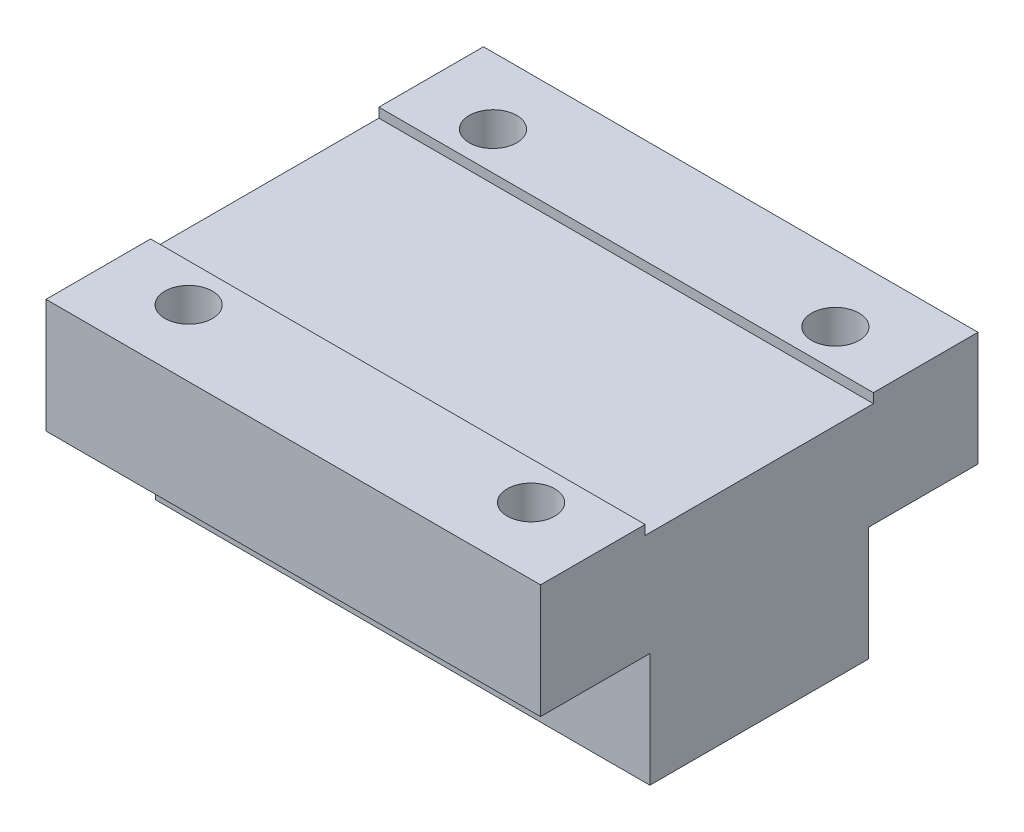
ISO-10303-21;
HEADER;
FILE_DESCRIPTION(('STEP AP214'),'2;1');
FILE_NAME('part.step','',(''),(''),'','','');
FILE_SCHEMA(('AUTOMOTIVE_DESIGN { 1 0 10303 214 1 1 1 1 }'));
ENDSEC;
DATA;
#1=APPLICATION_CONTEXT('core data for automotive mechanical design processes');
#2=APPLICATION_PROTOCOL_DEFINITION('international standard','automotive_design',2000,#1);
#3=PRODUCT_CONTEXT('',#1,'mechanical');
#4=PRODUCT('Part','Part','',(#3));
#5=PRODUCT_RELATED_PRODUCT_CATEGORY('part','',(#4));
#6=PRODUCT_DEFINITION_FORMATION('','',#4);
#7=PRODUCT_DEFINITION_CONTEXT('part definition',#1,'design');
#8=PRODUCT_DEFINITION('design','',#6,#7);
#9=PRODUCT_DEFINITION_SHAPE('','',#8);
#10=(LENGTH_UNIT() NAMED_UNIT(*) SI_UNIT(.MILLI.,.METRE.));
#11=(NAMED_UNIT(*) PLANE_ANGLE_UNIT() SI_UNIT($,.RADIAN.));
#12=(NAMED_UNIT(*) SI_UNIT($,.STERADIAN.) SOLID_ANGLE_UNIT());
#13=UNCERTAINTY_MEASURE_WITH_UNIT(LENGTH_MEASURE(1.E-05),#10,'distance_accuracy_value','');
#14=(GEOMETRIC_REPRESENTATION_CONTEXT(3) GLOBAL_UNCERTAINTY_ASSIGNED_CONTEXT((#13)) GLOBAL_UNIT_ASSIGNED_CONTEXT((#10,
#11,#12)) REPRESENTATION_CONTEXT('',''));
#15=CARTESIAN_POINT('',(0.,0.,0.));
#16=DIRECTION('',(0.,0.,1.));
#17=DIRECTION('',(1.,0.,0.));
#18=AXIS2_PLACEMENT_3D('',#15,#16,#17);
#19=CARTESIAN_POINT('',(0.,12.,0.));
#20=DIRECTION('',(0.,-1.,0.));
#21=DIRECTION('',(0.,0.,-1.));
#22=AXIS2_PLACEMENT_3D('',#19,#20,#21);
#23=PLANE('',#22);
#24=CARTESIAN_POINT('',(8.,12.,-39.));
#25=DIRECTION('',(0.,1.,0.));
#26=DIRECTION('',(0.,0.,1.));
#27=AXIS2_PLACEMENT_3D('',#24,#25,#26);
#28=CIRCLE('',#27,2.5);
#29=CARTESIAN_POINT('',(8.,12.,-36.5));
#30=VERTEX_POINT('',#29);
#31=EDGE_CURVE('E169',#30,#30,#28,.T.);
#32=ORIENTED_EDGE('',*,*,#31,.F.);
#33=EDGE_LOOP('',(#32));
#34=FACE_BOUND('',#33,.T.);
#35=CARTESIAN_POINT('',(44.,12.,-39.));
#36=DIRECTION('',(0.,1.,0.));
#37=DIRECTION('',(0.,0.,-1.));
#38=AXIS2_PLACEMENT_3D('',#35,#36,#37);
#39=CIRCLE('',#38,2.5);
#40=CARTESIAN_POINT('',(44.,12.,-41.5));
#41=VERTEX_POINT('',#40);
#42=EDGE_CURVE('E153',#41,#41,#39,.T.);
#43=ORIENTED_EDGE('',*,*,#42,.F.);
#44=EDGE_LOOP('',(#43));
#45=FACE_BOUND('',#44,.T.);
#46=DIRECTION('',(0.,0.,1.));
#47=VECTOR('',#46,1.);
#48=CARTESIAN_POINT('',(0.,12.,0.));
#49=LINE('',#48,#47);
#50=CARTESIAN_POINT('',(0.,12.,-46.));
#51=VERTEX_POINT('',#50);
#52=CARTESIAN_POINT('',(0.,12.,-35.));
#53=VERTEX_POINT('',#52);
#54=EDGE_CURVE('E229',#51,#53,#49,.T.);
#55=ORIENTED_EDGE('',*,*,#54,.T.);
#56=DIRECTION('',(1.,0.,0.));
#57=VECTOR('',#56,1.);
#58=CARTESIAN_POINT('',(0.,12.,-35.));
#59=LINE('',#58,#57);
#60=CARTESIAN_POINT('',(52.,12.,-35.));
#61=VERTEX_POINT('',#60);
#62=EDGE_CURVE('E45',#53,#61,#59,.T.);
#63=ORIENTED_EDGE('',*,*,#62,.T.);
#64=DIRECTION('',(0.,0.,-1.));
#65=VECTOR('',#64,1.);
#66=CARTESIAN_POINT('',(52.,12.,0.));
#67=LINE('',#66,#65);
#68=CARTESIAN_POINT('',(52.,12.,-46.));
#69=VERTEX_POINT('',#68);
#70=EDGE_CURVE('E226',#61,#69,#67,.T.);
#71=ORIENTED_EDGE('',*,*,#70,.T.);
#72=DIRECTION('',(-1.,0.,0.));
#73=VECTOR('',#72,1.);
#74=CARTESIAN_POINT('',(0.,12.,-46.));
#75=LINE('',#74,#73);
#76=EDGE_CURVE('E240',#69,#51,#75,.T.);
#77=ORIENTED_EDGE('',*,*,#76,.T.);
#78=EDGE_LOOP('',(#55,#63,#71,#77));
#79=FACE_BOUND('',#78,.T.);
#80=ADVANCED_FACE('F37',(#34,#45,#79),#23,.F.);
#81=CARTESIAN_POINT('',(0.,0.,0.));
#82=DIRECTION('',(0.,-1.,0.));
#83=DIRECTION('',(0.,0.,-1.));
#84=AXIS2_PLACEMENT_3D('',#81,#82,#83);
#85=PLANE('',#84);
#86=CARTESIAN_POINT('',(44.,0.,-7.));
#87=DIRECTION('',(0.,-1.,0.));
#88=DIRECTION('',(0.,0.,-1.));
#89=AXIS2_PLACEMENT_3D('',#86,#87,#88);
#90=CIRCLE('',#89,2.5);
#91=CARTESIAN_POINT('',(44.,0.,-9.50000000000001));
#92=VERTEX_POINT('',#91);
#93=EDGE_CURVE('E160',#92,#92,#90,.T.);
#94=ORIENTED_EDGE('',*,*,#93,.F.);
#95=EDGE_LOOP('',(#94));
#96=FACE_BOUND('',#95,.T.);
#97=CARTESIAN_POINT('',(8.00000000000001,0.,-7.));
#98=DIRECTION('',(0.,-1.,0.));
#99=DIRECTION('',(0.,0.,-1.));
#100=AXIS2_PLACEMENT_3D('',#97,#98,#99);
#101=CIRCLE('',#100,2.5);
#102=CARTESIAN_POINT('',(8.00000000000001,0.,-9.5));
#103=VERTEX_POINT('',#102);
#104=EDGE_CURVE('E166',#103,#103,#101,.T.);
#105=ORIENTED_EDGE('',*,*,#104,.F.);
#106=EDGE_LOOP('',(#105));
#107=FACE_BOUND('',#106,.T.);
#108=DIRECTION('',(-1.,0.,0.));
#109=VECTOR('',#108,1.);
#110=CARTESIAN_POINT('',(0.,0.,-11.5));
#111=LINE('',#110,#109);
#112=CARTESIAN_POINT('',(52.,0.,-11.5));
#113=VERTEX_POINT('',#112);
#114=CARTESIAN_POINT('',(0.,0.,-11.5));
#115=VERTEX_POINT('',#114);
#116=EDGE_CURVE('E60',#113,#115,#111,.T.);
#117=ORIENTED_EDGE('',*,*,#116,.F.);
#118=DIRECTION('',(0.,0.,-1.));
#119=VECTOR('',#118,1.);
#120=CARTESIAN_POINT('',(52.,0.,0.));
#121=LINE('',#120,#119);
#122=CARTESIAN_POINT('',(52.,0.,0.));
#123=VERTEX_POINT('',#122);
#124=EDGE_CURVE('E263',#123,#113,#121,.T.);
#125=ORIENTED_EDGE('',*,*,#124,.F.);
#126=DIRECTION('',(1.,0.,0.));
#127=VECTOR('',#126,1.);
#128=CARTESIAN_POINT('',(0.,0.,0.));
#129=LINE('',#128,#127);
#130=CARTESIAN_POINT('',(0.,0.,0.));
#131=VERTEX_POINT('',#130);
#132=EDGE_CURVE('E247',#131,#123,#129,.T.);
#133=ORIENTED_EDGE('',*,*,#132,.F.);
#134=DIRECTION('',(0.,0.,1.));
#135=VECTOR('',#134,1.);
#136=CARTESIAN_POINT('',(0.,0.,0.));
#137=LINE('',#136,#135);
#138=EDGE_CURVE('E204',#115,#131,#137,.T.);
#139=ORIENTED_EDGE('',*,*,#138,.F.);
#140=EDGE_LOOP('',(#117,#125,#133,#139));
#141=FACE_BOUND('',#140,.T.);
#142=ADVANCED_FACE('F273',(#96,#107,#141),#85,.T.);
#143=CARTESIAN_POINT('',(0.,12.,0.));
#144=DIRECTION('',(1.,0.,0.));
#145=DIRECTION('',(0.,0.,-1.));
#146=AXIS2_PLACEMENT_3D('',#143,#144,#145);
#147=PLANE('',#146);
#148=DIRECTION('',(0.,0.,1.));
#149=VECTOR('',#148,1.);
#150=CARTESIAN_POINT('',(0.,11.,-35.));
#151=LINE('',#150,#149);
#152=CARTESIAN_POINT('',(0.,11.,-35.));
#153=VERTEX_POINT('',#152);
#154=CARTESIAN_POINT('',(0.,11.,-11.));
#155=VERTEX_POINT('',#154);
#156=EDGE_CURVE('E135',#153,#155,#151,.T.);
#157=ORIENTED_EDGE('',*,*,#156,.F.);
#158=DIRECTION('',(0.,-1.,0.));
#159=VECTOR('',#158,1.);
#160=CARTESIAN_POINT('',(0.,11.,-35.));
#161=LINE('',#160,#159);
#162=EDGE_CURVE('E132',#53,#153,#161,.T.);
#163=ORIENTED_EDGE('',*,*,#162,.F.);
#164=ORIENTED_EDGE('',*,*,#54,.F.);
#165=DIRECTION('',(0.,-1.,0.));
#166=VECTOR('',#165,1.);
#167=CARTESIAN_POINT('',(0.,12.,-46.));
#168=LINE('',#167,#166);
#169=CARTESIAN_POINT('',(0.,0.,-46.));
#170=VERTEX_POINT('',#169);
#171=EDGE_CURVE('E244',#51,#170,#168,.T.);
#172=ORIENTED_EDGE('',*,*,#171,.T.);
#173=CARTESIAN_POINT('',(0.,0.,-34.5));
#174=VERTEX_POINT('',#173);
#175=EDGE_CURVE('E251',#170,#174,#137,.T.);
#176=ORIENTED_EDGE('',*,*,#175,.T.);
#177=DIRECTION('',(0.,1.,0.));
#178=VECTOR('',#177,1.);
#179=CARTESIAN_POINT('',(0.,-12.,-34.5));
#180=LINE('',#179,#178);
#181=CARTESIAN_POINT('',(0.,-12.,-34.5));
#182=VERTEX_POINT('',#181);
#183=EDGE_CURVE('E198',#182,#174,#180,.T.);
#184=ORIENTED_EDGE('',*,*,#183,.F.);
#185=DIRECTION('',(0.,0.,-1.));
#186=VECTOR('',#185,1.);
#187=CARTESIAN_POINT('',(0.,-12.,-34.5));
#188=LINE('',#187,#186);
#189=CARTESIAN_POINT('',(0.,-12.,-11.5));
#190=VERTEX_POINT('',#189);
#191=EDGE_CURVE('E173',#190,#182,#188,.T.);
#192=ORIENTED_EDGE('',*,*,#191,.F.);
#193=DIRECTION('',(0.,1.,0.));
#194=VECTOR('',#193,1.);
#195=CARTESIAN_POINT('',(0.,-12.,-11.5));
#196=LINE('',#195,#194);
#197=EDGE_CURVE('E182',#190,#115,#196,.T.);
#198=ORIENTED_EDGE('',*,*,#197,.T.);
#199=ORIENTED_EDGE('',*,*,#138,.T.);
#200=DIRECTION('',(0.,-1.,0.));
#201=VECTOR('',#200,1.);
#202=CARTESIAN_POINT('',(0.,12.,0.));
#203=LINE('',#202,#201);
#204=CARTESIAN_POINT('',(0.,12.,0.));
#205=VERTEX_POINT('',#204);
#206=EDGE_CURVE('E221',#205,#131,#203,.T.);
#207=ORIENTED_EDGE('',*,*,#206,.F.);
#208=CARTESIAN_POINT('',(0.,12.,-11.));
#209=VERTEX_POINT('',#208);
#210=EDGE_CURVE('E144',#209,#205,#49,.T.);
#211=ORIENTED_EDGE('',*,*,#210,.F.);
#212=DIRECTION('',(0.,1.,0.));
#213=VECTOR('',#212,1.);
#214=CARTESIAN_POINT('',(0.,11.,-11.));
#215=LINE('',#214,#213);
#216=EDGE_CURVE('E52',#155,#209,#215,.T.);
#217=ORIENTED_EDGE('',*,*,#216,.F.);
#218=EDGE_LOOP('',(#157,#163,#164,#172,#176,#184,#192,#198,#199,#207,#211,#217));
#219=FACE_BOUND('',#218,.T.);
#220=ADVANCED_FACE('F39',(#219),#147,.F.);
#221=CARTESIAN_POINT('',(0.,12.,0.));
#222=DIRECTION('',(0.,0.,-1.));
#223=DIRECTION('',(-1.,0.,0.));
#224=AXIS2_PLACEMENT_3D('',#221,#222,#223);
#225=PLANE('',#224);
#226=ORIENTED_EDGE('',*,*,#132,.T.);
#227=DIRECTION('',(0.,-1.,0.));
#228=VECTOR('',#227,1.);
#229=CARTESIAN_POINT('',(52.,12.,0.));
#230=LINE('',#229,#228);
#231=CARTESIAN_POINT('',(52.,12.,0.));
#232=VERTEX_POINT('',#231);
#233=EDGE_CURVE('E256',#232,#123,#230,.T.);
#234=ORIENTED_EDGE('',*,*,#233,.F.);
#235=DIRECTION('',(1.,0.,0.));
#236=VECTOR('',#235,1.);
#237=CARTESIAN_POINT('',(0.,12.,0.));
#238=LINE('',#237,#236);
#239=EDGE_CURVE('E237',#205,#232,#238,.T.);
#240=ORIENTED_EDGE('',*,*,#239,.F.);
#241=ORIENTED_EDGE('',*,*,#206,.T.);
#242=EDGE_LOOP('',(#226,#234,#240,#241));
#243=FACE_BOUND('',#242,.T.);
#244=ADVANCED_FACE('F270',(#243),#225,.F.);
#245=CARTESIAN_POINT('',(52.,12.,0.));
#246=DIRECTION('',(-1.,0.,0.));
#247=DIRECTION('',(0.,0.,1.));
#248=AXIS2_PLACEMENT_3D('',#245,#246,#247);
#249=PLANE('',#248);
#250=ORIENTED_EDGE('',*,*,#70,.F.);
#251=DIRECTION('',(0.,-1.,0.));
#252=VECTOR('',#251,1.);
#253=CARTESIAN_POINT('',(52.,12.,-35.));
#254=LINE('',#253,#252);
#255=CARTESIAN_POINT('',(52.,11.,-35.));
#256=VERTEX_POINT('',#255);
#257=EDGE_CURVE('E150',#61,#256,#254,.T.);
#258=ORIENTED_EDGE('',*,*,#257,.T.);
#259=DIRECTION('',(0.,0.,1.));
#260=VECTOR('',#259,1.);
#261=CARTESIAN_POINT('',(52.,11.,0.));
#262=LINE('',#261,#260);
#263=CARTESIAN_POINT('',(52.,11.,-11.));
#264=VERTEX_POINT('',#263);
#265=EDGE_CURVE('E11',#256,#264,#262,.T.);
#266=ORIENTED_EDGE('',*,*,#265,.T.);
#267=DIRECTION('',(0.,1.,0.));
#268=VECTOR('',#267,1.);
#269=CARTESIAN_POINT('',(52.,12.,-11.));
#270=LINE('',#269,#268);
#271=CARTESIAN_POINT('',(52.,12.,-11.));
#272=VERTEX_POINT('',#271);
#273=EDGE_CURVE('E129',#264,#272,#270,.T.);
#274=ORIENTED_EDGE('',*,*,#273,.T.);
#275=EDGE_CURVE('E236',#232,#272,#67,.T.);
#276=ORIENTED_EDGE('',*,*,#275,.F.);
#277=ORIENTED_EDGE('',*,*,#233,.T.);
#278=ORIENTED_EDGE('',*,*,#124,.T.);
#279=DIRECTION('',(0.,1.,0.));
#280=VECTOR('',#279,1.);
#281=CARTESIAN_POINT('',(52.,-12.,-11.5));
#282=LINE('',#281,#280);
#283=CARTESIAN_POINT('',(52.,-12.,-11.5));
#284=VERTEX_POINT('',#283);
#285=EDGE_CURVE('E199',#284,#113,#282,.T.);
#286=ORIENTED_EDGE('',*,*,#285,.F.);
#287=DIRECTION('',(0.,0.,1.));
#288=VECTOR('',#287,1.);
#289=CARTESIAN_POINT('',(52.,-12.,-34.5));
#290=LINE('',#289,#288);
#291=CARTESIAN_POINT('',(52.,-12.,-34.5));
#292=VERTEX_POINT('',#291);
#293=EDGE_CURVE('E178',#292,#284,#290,.T.);
#294=ORIENTED_EDGE('',*,*,#293,.F.);
#295=DIRECTION('',(0.,1.,0.));
#296=VECTOR('',#295,1.);
#297=CARTESIAN_POINT('',(52.,-12.,-34.5));
#298=LINE('',#297,#296);
#299=CARTESIAN_POINT('',(52.,0.,-34.5));
#300=VERTEX_POINT('',#299);
#301=EDGE_CURVE('E195',#292,#300,#298,.T.);
#302=ORIENTED_EDGE('',*,*,#301,.T.);
#303=CARTESIAN_POINT('',(52.,0.,-46.));
#304=VERTEX_POINT('',#303);
#305=EDGE_CURVE('E192',#300,#304,#121,.T.);
#306=ORIENTED_EDGE('',*,*,#305,.T.);
#307=DIRECTION('',(0.,-1.,0.));
#308=VECTOR('',#307,1.);
#309=CARTESIAN_POINT('',(52.,12.,-46.));
#310=LINE('',#309,#308);
#311=EDGE_CURVE('E234',#69,#304,#310,.T.);
#312=ORIENTED_EDGE('',*,*,#311,.F.);
#313=EDGE_LOOP('',(#250,#258,#266,#274,#276,#277,#278,#286,#294,#302,#306,#312));
#314=FACE_BOUND('',#313,.T.);
#315=ADVANCED_FACE('F232',(#314),#249,.F.);
#316=CARTESIAN_POINT('',(0.,12.,-46.));
#317=DIRECTION('',(0.,0.,1.));
#318=DIRECTION('',(1.,0.,0.));
#319=AXIS2_PLACEMENT_3D('',#316,#317,#318);
#320=PLANE('',#319);
#321=DIRECTION('',(-1.,0.,0.));
#322=VECTOR('',#321,1.);
#323=CARTESIAN_POINT('',(0.,0.,-46.));
#324=LINE('',#323,#322);
#325=EDGE_CURVE('E262',#304,#170,#324,.T.);
#326=ORIENTED_EDGE('',*,*,#325,.T.);
#327=ORIENTED_EDGE('',*,*,#171,.F.);
#328=ORIENTED_EDGE('',*,*,#76,.F.);
#329=ORIENTED_EDGE('',*,*,#311,.T.);
#330=EDGE_LOOP('',(#326,#327,#328,#329));
#331=FACE_BOUND('',#330,.T.);
#332=ADVANCED_FACE('F298',(#331),#320,.F.);
#333=CARTESIAN_POINT('',(44.,12.,-7.));
#334=DIRECTION('',(0.,1.,0.));
#335=DIRECTION('',(0.,0.,1.));
#336=AXIS2_PLACEMENT_3D('',#333,#334,#335);
#337=CIRCLE('',#336,2.5);
#338=CARTESIAN_POINT('',(44.,12.,-4.5));
#339=VERTEX_POINT('',#338);
#340=EDGE_CURVE('E157',#339,#339,#337,.T.);
#341=ORIENTED_EDGE('',*,*,#340,.F.);
#342=EDGE_LOOP('',(#341));
#343=FACE_BOUND('',#342,.T.);
#344=CARTESIAN_POINT('',(8.00000000000001,12.,-7.));
#345=DIRECTION('',(0.,1.,0.));
#346=DIRECTION('',(0.,0.,-1.));
#347=AXIS2_PLACEMENT_3D('',#344,#345,#346);
#348=CIRCLE('',#347,2.5);
#349=CARTESIAN_POINT('',(8.00000000000001,12.,-9.5));
#350=VERTEX_POINT('',#349);
#351=EDGE_CURVE('E163',#350,#350,#348,.T.);
#352=ORIENTED_EDGE('',*,*,#351,.F.);
#353=EDGE_LOOP('',(#352));
#354=FACE_BOUND('',#353,.T.);
#355=ORIENTED_EDGE('',*,*,#275,.T.);
#356=DIRECTION('',(-1.,0.,0.));
#357=VECTOR('',#356,1.);
#358=CARTESIAN_POINT('',(0.,12.,-11.));
#359=LINE('',#358,#357);
#360=EDGE_CURVE('E220',#272,#209,#359,.T.);
#361=ORIENTED_EDGE('',*,*,#360,.T.);
#362=ORIENTED_EDGE('',*,*,#210,.T.);
#363=ORIENTED_EDGE('',*,*,#239,.T.);
#364=EDGE_LOOP('',(#355,#361,#362,#363));
#365=FACE_BOUND('',#364,.T.);
#366=ADVANCED_FACE('F284',(#343,#354,#365),#23,.F.);
#367=CARTESIAN_POINT('',(44.,0.,-39.));
#368=DIRECTION('',(0.,-1.,0.));
#369=DIRECTION('',(0.,0.,-1.));
#370=AXIS2_PLACEMENT_3D('',#367,#368,#369);
#371=CIRCLE('',#370,2.5);
#372=CARTESIAN_POINT('',(44.,0.,-41.5));
#373=VERTEX_POINT('',#372);
#374=EDGE_CURVE('E156',#373,#373,#371,.T.);
#375=ORIENTED_EDGE('',*,*,#374,.F.);
#376=EDGE_LOOP('',(#375));
#377=FACE_BOUND('',#376,.T.);
#378=CARTESIAN_POINT('',(8.,0.,-39.));
#379=DIRECTION('',(0.,-1.,0.));
#380=DIRECTION('',(0.,0.,-1.));
#381=AXIS2_PLACEMENT_3D('',#378,#379,#380);
#382=CIRCLE('',#381,2.5);
#383=CARTESIAN_POINT('',(8.,0.,-41.5));
#384=VERTEX_POINT('',#383);
#385=EDGE_CURVE('E172',#384,#384,#382,.T.);
#386=ORIENTED_EDGE('',*,*,#385,.F.);
#387=EDGE_LOOP('',(#386));
#388=FACE_BOUND('',#387,.T.);
#389=DIRECTION('',(1.,0.,0.));
#390=VECTOR('',#389,1.);
#391=CARTESIAN_POINT('',(0.,0.,-34.5));
#392=LINE('',#391,#390);
#393=EDGE_CURVE('E188',#174,#300,#392,.T.);
#394=ORIENTED_EDGE('',*,*,#393,.F.);
#395=ORIENTED_EDGE('',*,*,#175,.F.);
#396=ORIENTED_EDGE('',*,*,#325,.F.);
#397=ORIENTED_EDGE('',*,*,#305,.F.);
#398=EDGE_LOOP('',(#394,#395,#396,#397));
#399=FACE_BOUND('',#398,.T.);
#400=ADVANCED_FACE('F277',(#377,#388,#399),#85,.T.);
#401=CARTESIAN_POINT('',(0.,-12.,-34.5));
#402=DIRECTION('',(0.,0.,1.));
#403=DIRECTION('',(1.,0.,0.));
#404=AXIS2_PLACEMENT_3D('',#401,#402,#403);
#405=PLANE('',#404);
#406=ORIENTED_EDGE('',*,*,#393,.T.);
#407=ORIENTED_EDGE('',*,*,#301,.F.);
#408=DIRECTION('',(1.,0.,0.));
#409=VECTOR('',#408,1.);
#410=CARTESIAN_POINT('',(0.,-12.,-34.5));
#411=LINE('',#410,#409);
#412=EDGE_CURVE('E176',#182,#292,#411,.T.);
#413=ORIENTED_EDGE('',*,*,#412,.F.);
#414=ORIENTED_EDGE('',*,*,#183,.T.);
#415=EDGE_LOOP('',(#406,#407,#413,#414));
#416=FACE_BOUND('',#415,.T.);
#417=ADVANCED_FACE('F289',(#416),#405,.F.);
#418=CARTESIAN_POINT('',(0.,-12.,-11.5));
#419=DIRECTION('',(0.,0.,-1.));
#420=DIRECTION('',(-1.,0.,0.));
#421=AXIS2_PLACEMENT_3D('',#418,#419,#420);
#422=PLANE('',#421);
#423=ORIENTED_EDGE('',*,*,#116,.T.);
#424=ORIENTED_EDGE('',*,*,#197,.F.);
#425=DIRECTION('',(-1.,0.,0.));
#426=VECTOR('',#425,1.);
#427=CARTESIAN_POINT('',(0.,-12.,-11.5));
#428=LINE('',#427,#426);
#429=EDGE_CURVE('E180',#284,#190,#428,.T.);
#430=ORIENTED_EDGE('',*,*,#429,.F.);
#431=ORIENTED_EDGE('',*,*,#285,.T.);
#432=EDGE_LOOP('',(#423,#424,#430,#431));
#433=FACE_BOUND('',#432,.T.);
#434=ADVANCED_FACE('F295',(#433),#422,.F.);
#435=CARTESIAN_POINT('',(0.,-12.,0.));
#436=DIRECTION('',(0.,1.,0.));
#437=DIRECTION('',(0.,0.,1.));
#438=AXIS2_PLACEMENT_3D('',#435,#436,#437);
#439=PLANE('',#438);
#440=ORIENTED_EDGE('',*,*,#191,.T.);
#441=ORIENTED_EDGE('',*,*,#412,.T.);
#442=ORIENTED_EDGE('',*,*,#293,.T.);
#443=ORIENTED_EDGE('',*,*,#429,.T.);
#444=EDGE_LOOP('',(#440,#441,#442,#443));
#445=FACE_BOUND('',#444,.T.);
#446=ADVANCED_FACE('F312',(#445),#439,.F.);
#447=CARTESIAN_POINT('',(8.,-12.000025,-39.));
#448=DIRECTION('',(0.,1.,0.));
#449=DIRECTION('',(0.,0.,1.));
#450=AXIS2_PLACEMENT_3D('',#447,#448,#449);
#451=CYLINDRICAL_SURFACE('',#450,2.5);
#452=ORIENTED_EDGE('',*,*,#385,.T.);
#453=EDGE_LOOP('',(#452));
#454=FACE_BOUND('',#453,.T.);
#455=ORIENTED_EDGE('',*,*,#31,.T.);
#456=EDGE_LOOP('',(#455));
#457=FACE_BOUND('',#456,.T.);
#458=ADVANCED_FACE('F321',(#454,#457),#451,.F.);
#459=CARTESIAN_POINT('',(8.00000000000001,-12.000025,-7.));
#460=DIRECTION('',(0.,1.,0.));
#461=DIRECTION('',(0.,0.,1.));
#462=AXIS2_PLACEMENT_3D('',#459,#460,#461);
#463=CYLINDRICAL_SURFACE('',#462,2.5);
#464=ORIENTED_EDGE('',*,*,#104,.T.);
#465=EDGE_LOOP('',(#464));
#466=FACE_BOUND('',#465,.T.);
#467=ORIENTED_EDGE('',*,*,#351,.T.);
#468=EDGE_LOOP('',(#467));
#469=FACE_BOUND('',#468,.T.);
#470=ADVANCED_FACE('F326',(#466,#469),#463,.F.);
#471=CARTESIAN_POINT('',(44.,-12.000025,-7.));
#472=DIRECTION('',(0.,1.,0.));
#473=DIRECTION('',(0.,0.,1.));
#474=AXIS2_PLACEMENT_3D('',#471,#472,#473);
#475=CYLINDRICAL_SURFACE('',#474,2.5);
#476=ORIENTED_EDGE('',*,*,#93,.T.);
#477=EDGE_LOOP('',(#476));
#478=FACE_BOUND('',#477,.T.);
#479=ORIENTED_EDGE('',*,*,#340,.T.);
#480=EDGE_LOOP('',(#479));
#481=FACE_BOUND('',#480,.T.);
#482=ADVANCED_FACE('F330',(#478,#481),#475,.F.);
#483=CARTESIAN_POINT('',(44.,-12.000025,-39.));
#484=DIRECTION('',(0.,1.,0.));
#485=DIRECTION('',(0.,0.,1.));
#486=AXIS2_PLACEMENT_3D('',#483,#484,#485);
#487=CYLINDRICAL_SURFACE('',#486,2.5);
#488=ORIENTED_EDGE('',*,*,#374,.T.);
#489=EDGE_LOOP('',(#488));
#490=FACE_BOUND('',#489,.T.);
#491=ORIENTED_EDGE('',*,*,#42,.T.);
#492=EDGE_LOOP('',(#491));
#493=FACE_BOUND('',#492,.T.);
#494=ADVANCED_FACE('F334',(#490,#493),#487,.F.);
#495=CARTESIAN_POINT('',(52.00005,11.,-35.));
#496=DIRECTION('',(0.,-1.,0.));
#497=DIRECTION('',(0.,0.,-1.));
#498=AXIS2_PLACEMENT_3D('',#495,#496,#497);
#499=PLANE('',#498);
#500=DIRECTION('',(-1.,0.,0.));
#501=VECTOR('',#500,1.);
#502=CARTESIAN_POINT('',(52.00005,11.,-35.));
#503=LINE('',#502,#501);
#504=EDGE_CURVE('E131',#256,#153,#503,.T.);
#505=ORIENTED_EDGE('',*,*,#504,.T.);
#506=ORIENTED_EDGE('',*,*,#156,.T.);
#507=DIRECTION('',(-1.,0.,0.));
#508=VECTOR('',#507,1.);
#509=CARTESIAN_POINT('',(52.00005,11.,-11.));
#510=LINE('',#509,#508);
#511=EDGE_CURVE('E125',#264,#155,#510,.T.);
#512=ORIENTED_EDGE('',*,*,#511,.F.);
#513=ORIENTED_EDGE('',*,*,#265,.F.);
#514=EDGE_LOOP('',(#505,#506,#512,#513));
#515=FACE_BOUND('',#514,.T.);
#516=ADVANCED_FACE('F136',(#515),#499,.F.);
#517=CARTESIAN_POINT('',(52.00005,11.,-35.));
#518=DIRECTION('',(0.,0.,-1.));
#519=DIRECTION('',(-1.,0.,0.));
#520=AXIS2_PLACEMENT_3D('',#517,#518,#519);
#521=PLANE('',#520);
#522=ORIENTED_EDGE('',*,*,#62,.F.);
#523=ORIENTED_EDGE('',*,*,#162,.T.);
#524=ORIENTED_EDGE('',*,*,#504,.F.);
#525=ORIENTED_EDGE('',*,*,#257,.F.);
#526=EDGE_LOOP('',(#522,#523,#524,#525));
#527=FACE_BOUND('',#526,.T.);
#528=ADVANCED_FACE('F341',(#527),#521,.F.);
#529=CARTESIAN_POINT('',(52.00005,11.,-11.));
#530=DIRECTION('',(0.,0.,1.));
#531=DIRECTION('',(0.,-1.,0.));
#532=AXIS2_PLACEMENT_3D('',#529,#530,#531);
#533=PLANE('',#532);
#534=ORIENTED_EDGE('',*,*,#511,.T.);
#535=ORIENTED_EDGE('',*,*,#216,.T.);
#536=ORIENTED_EDGE('',*,*,#360,.F.);
#537=ORIENTED_EDGE('',*,*,#273,.F.);
#538=EDGE_LOOP('',(#534,#535,#536,#537));
#539=FACE_BOUND('',#538,.T.);
#540=ADVANCED_FACE('F127',(#539),#533,.F.);
#541=CLOSED_SHELL('',(#80,#142,#220,#244,#315,#332,#366,#400,#417,#434,#446,#458,#470,#482,#494,
#516,#528,#540));
#542=MANIFOLD_SOLID_BREP('B2',#541);
#543=ADVANCED_BREP_SHAPE_REPRESENTATION('',(#18,#542),#14);
#544=SHAPE_DEFINITION_REPRESENTATION(#9,#543);
ENDSEC;
END-ISO-10303-21;
